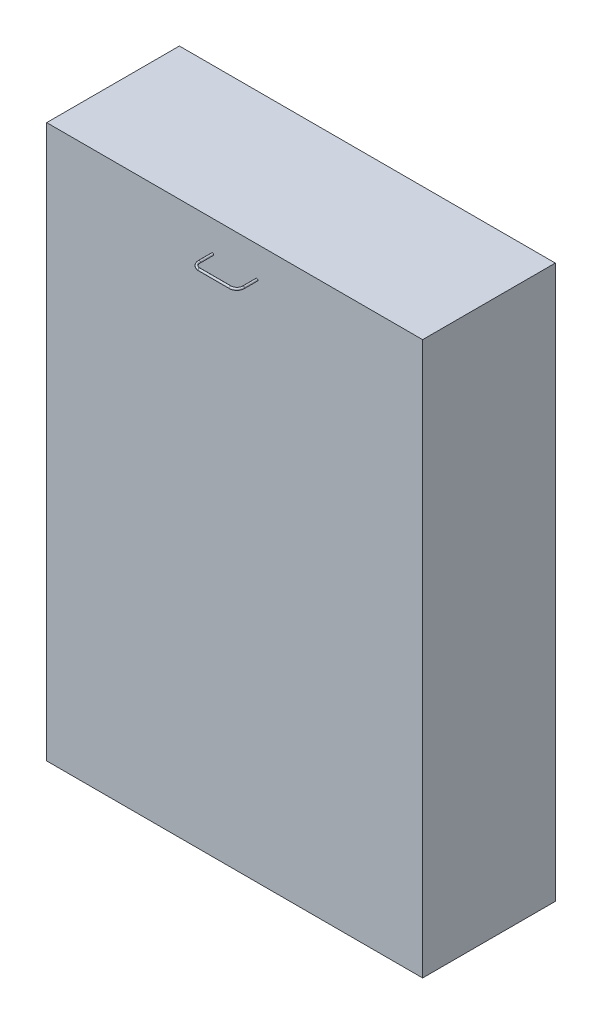
ISO-10303-21;
HEADER;
FILE_DESCRIPTION(('STEP AP214'),'2;1');
FILE_NAME('part.step','',(''),(''),'','','');
FILE_SCHEMA(('AUTOMOTIVE_DESIGN { 1 0 10303 214 1 1 1 1 }'));
ENDSEC;
DATA;
#1=APPLICATION_CONTEXT('core data for automotive mechanical design processes');
#2=APPLICATION_PROTOCOL_DEFINITION('international standard','automotive_design',2000,#1);
#3=PRODUCT_CONTEXT('',#1,'mechanical');
#4=PRODUCT('Part','Part','',(#3));
#5=PRODUCT_RELATED_PRODUCT_CATEGORY('part','',(#4));
#6=PRODUCT_DEFINITION_FORMATION('','',#4);
#7=PRODUCT_DEFINITION_CONTEXT('part definition',#1,'design');
#8=PRODUCT_DEFINITION('design','',#6,#7);
#9=PRODUCT_DEFINITION_SHAPE('','',#8);
#10=(LENGTH_UNIT() NAMED_UNIT(*) SI_UNIT(.MILLI.,.METRE.));
#11=(NAMED_UNIT(*) PLANE_ANGLE_UNIT() SI_UNIT($,.RADIAN.));
#12=(NAMED_UNIT(*) SI_UNIT($,.STERADIAN.) SOLID_ANGLE_UNIT());
#13=UNCERTAINTY_MEASURE_WITH_UNIT(LENGTH_MEASURE(1.E-05),#10,'distance_accuracy_value','');
#14=(GEOMETRIC_REPRESENTATION_CONTEXT(3) GLOBAL_UNCERTAINTY_ASSIGNED_CONTEXT((#13)) GLOBAL_UNIT_ASSIGNED_CONTEXT((#10,
#11,#12)) REPRESENTATION_CONTEXT('',''));
#15=CARTESIAN_POINT('',(0.,0.,0.));
#16=DIRECTION('',(0.,0.,1.));
#17=DIRECTION('',(1.,0.,0.));
#18=AXIS2_PLACEMENT_3D('',#15,#16,#17);
#19=CARTESIAN_POINT('',(0.,0.,300.));
#20=DIRECTION('',(0.,0.,1.));
#21=DIRECTION('',(1.,0.,0.));
#22=AXIS2_PLACEMENT_3D('',#19,#20,#21);
#23=PLANE('',#22);
#24=CARTESIAN_POINT('',(-50.,0.,300.));
#25=DIRECTION('',(0.,0.,1.));
#26=DIRECTION('',(1.,0.,0.));
#27=AXIS2_PLACEMENT_3D('',#24,#25,#26);
#28=CIRCLE('',#27,2.5);
#29=CARTESIAN_POINT('',(-47.5,0.,300.));
#30=VERTEX_POINT('',#29);
#31=EDGE_CURVE('E11',#30,#30,#28,.T.);
#32=ORIENTED_EDGE('',*,*,#31,.F.);
#33=EDGE_LOOP('',(#32));
#34=FACE_BOUND('',#33,.T.);
#35=DIRECTION('',(0.,1.,0.));
#36=VECTOR('',#35,1.);
#37=CARTESIAN_POINT('',(425.,70.,300.));
#38=LINE('',#37,#36);
#39=CARTESIAN_POINT('',(425.,-1180.,300.));
#40=VERTEX_POINT('',#39);
#41=CARTESIAN_POINT('',(425.,70.,300.));
#42=VERTEX_POINT('',#41);
#43=EDGE_CURVE('E87',#40,#42,#38,.T.);
#44=ORIENTED_EDGE('',*,*,#43,.T.);
#45=DIRECTION('',(-1.,0.,0.));
#46=VECTOR('',#45,1.);
#47=CARTESIAN_POINT('',(-425.,70.,300.));
#48=LINE('',#47,#46);
#49=CARTESIAN_POINT('',(-425.,70.,300.));
#50=VERTEX_POINT('',#49);
#51=EDGE_CURVE('E82',#42,#50,#48,.T.);
#52=ORIENTED_EDGE('',*,*,#51,.T.);
#53=DIRECTION('',(0.,-1.,0.));
#54=VECTOR('',#53,1.);
#55=CARTESIAN_POINT('',(-425.,70.,300.));
#56=LINE('',#55,#54);
#57=CARTESIAN_POINT('',(-425.,-1180.,300.));
#58=VERTEX_POINT('',#57);
#59=EDGE_CURVE('E85',#50,#58,#56,.T.);
#60=ORIENTED_EDGE('',*,*,#59,.T.);
#61=DIRECTION('',(1.,0.,0.));
#62=VECTOR('',#61,1.);
#63=CARTESIAN_POINT('',(-425.,-1180.,300.));
#64=LINE('',#63,#62);
#65=EDGE_CURVE('E51',#58,#40,#64,.T.);
#66=ORIENTED_EDGE('',*,*,#65,.T.);
#67=EDGE_LOOP('',(#44,#52,#60,#66));
#68=FACE_BOUND('',#67,.T.);
#69=CARTESIAN_POINT('',(50.,0.,300.));
#70=DIRECTION('',(0.,0.,-1.));
#71=DIRECTION('',(-1.,0.,0.));
#72=AXIS2_PLACEMENT_3D('',#69,#70,#71);
#73=CIRCLE('',#72,2.5);
#74=CARTESIAN_POINT('',(47.5,0.,300.));
#75=VERTEX_POINT('',#74);
#76=EDGE_CURVE('E103',#75,#75,#73,.T.);
#77=ORIENTED_EDGE('',*,*,#76,.T.);
#78=EDGE_LOOP('',(#77));
#79=FACE_BOUND('',#78,.T.);
#80=ADVANCED_FACE('F33',(#34,#68,#79),#23,.T.);
#81=CARTESIAN_POINT('',(425.,70.,300.));
#82=DIRECTION('',(-1.,0.,0.));
#83=DIRECTION('',(0.,-1.,0.));
#84=AXIS2_PLACEMENT_3D('',#81,#82,#83);
#85=PLANE('',#84);
#86=DIRECTION('',(0.,1.,0.));
#87=VECTOR('',#86,1.);
#88=CARTESIAN_POINT('',(425.,70.,0.));
#89=LINE('',#88,#87);
#90=CARTESIAN_POINT('',(425.,-1180.,0.));
#91=VERTEX_POINT('',#90);
#92=CARTESIAN_POINT('',(425.,70.,0.));
#93=VERTEX_POINT('',#92);
#94=EDGE_CURVE('E100',#91,#93,#89,.T.);
#95=ORIENTED_EDGE('',*,*,#94,.T.);
#96=DIRECTION('',(0.,0.,-1.));
#97=VECTOR('',#96,1.);
#98=CARTESIAN_POINT('',(425.,70.,300.));
#99=LINE('',#98,#97);
#100=EDGE_CURVE('E37',#42,#93,#99,.T.);
#101=ORIENTED_EDGE('',*,*,#100,.F.);
#102=ORIENTED_EDGE('',*,*,#43,.F.);
#103=DIRECTION('',(0.,0.,-1.));
#104=VECTOR('',#103,1.);
#105=CARTESIAN_POINT('',(425.,-1180.,300.));
#106=LINE('',#105,#104);
#107=EDGE_CURVE('E96',#40,#91,#106,.T.);
#108=ORIENTED_EDGE('',*,*,#107,.T.);
#109=EDGE_LOOP('',(#95,#101,#102,#108));
#110=FACE_BOUND('',#109,.T.);
#111=ADVANCED_FACE('F35',(#110),#85,.F.);
#112=CARTESIAN_POINT('',(-425.,70.,300.));
#113=DIRECTION('',(0.,-1.,0.));
#114=DIRECTION('',(0.,0.,-1.));
#115=AXIS2_PLACEMENT_3D('',#112,#113,#114);
#116=PLANE('',#115);
#117=DIRECTION('',(-1.,0.,0.));
#118=VECTOR('',#117,1.);
#119=CARTESIAN_POINT('',(-425.,70.,0.));
#120=LINE('',#119,#118);
#121=CARTESIAN_POINT('',(-425.,70.,0.));
#122=VERTEX_POINT('',#121);
#123=EDGE_CURVE('E92',#93,#122,#120,.T.);
#124=ORIENTED_EDGE('',*,*,#123,.T.);
#125=DIRECTION('',(0.,0.,-1.));
#126=VECTOR('',#125,1.);
#127=CARTESIAN_POINT('',(-425.,70.,300.));
#128=LINE('',#127,#126);
#129=EDGE_CURVE('E90',#50,#122,#128,.T.);
#130=ORIENTED_EDGE('',*,*,#129,.F.);
#131=ORIENTED_EDGE('',*,*,#51,.F.);
#132=ORIENTED_EDGE('',*,*,#100,.T.);
#133=EDGE_LOOP('',(#124,#130,#131,#132));
#134=FACE_BOUND('',#133,.T.);
#135=ADVANCED_FACE('F91',(#134),#116,.F.);
#136=CARTESIAN_POINT('',(-425.,70.,300.));
#137=DIRECTION('',(1.,0.,0.));
#138=DIRECTION('',(0.,1.,0.));
#139=AXIS2_PLACEMENT_3D('',#136,#137,#138);
#140=PLANE('',#139);
#141=DIRECTION('',(0.,-1.,0.));
#142=VECTOR('',#141,1.);
#143=CARTESIAN_POINT('',(-425.,70.,0.));
#144=LINE('',#143,#142);
#145=CARTESIAN_POINT('',(-425.,-1180.,0.));
#146=VERTEX_POINT('',#145);
#147=EDGE_CURVE('E68',#122,#146,#144,.T.);
#148=ORIENTED_EDGE('',*,*,#147,.T.);
#149=DIRECTION('',(0.,0.,-1.));
#150=VECTOR('',#149,1.);
#151=CARTESIAN_POINT('',(-425.,-1180.,300.));
#152=LINE('',#151,#150);
#153=EDGE_CURVE('E93',#58,#146,#152,.T.);
#154=ORIENTED_EDGE('',*,*,#153,.F.);
#155=ORIENTED_EDGE('',*,*,#59,.F.);
#156=ORIENTED_EDGE('',*,*,#129,.T.);
#157=EDGE_LOOP('',(#148,#154,#155,#156));
#158=FACE_BOUND('',#157,.T.);
#159=ADVANCED_FACE('F94',(#158),#140,.F.);
#160=CARTESIAN_POINT('',(-425.,-1180.,300.));
#161=DIRECTION('',(0.,1.,0.));
#162=DIRECTION('',(0.,0.,1.));
#163=AXIS2_PLACEMENT_3D('',#160,#161,#162);
#164=PLANE('',#163);
#165=DIRECTION('',(1.,0.,0.));
#166=VECTOR('',#165,1.);
#167=CARTESIAN_POINT('',(-425.,-1180.,0.));
#168=LINE('',#167,#166);
#169=EDGE_CURVE('E74',#146,#91,#168,.T.);
#170=ORIENTED_EDGE('',*,*,#169,.T.);
#171=ORIENTED_EDGE('',*,*,#107,.F.);
#172=ORIENTED_EDGE('',*,*,#65,.F.);
#173=ORIENTED_EDGE('',*,*,#153,.T.);
#174=EDGE_LOOP('',(#170,#171,#172,#173));
#175=FACE_BOUND('',#174,.T.);
#176=ADVANCED_FACE('F108',(#175),#164,.F.);
#177=CARTESIAN_POINT('',(0.,0.,0.));
#178=DIRECTION('',(0.,0.,1.));
#179=DIRECTION('',(1.,0.,0.));
#180=AXIS2_PLACEMENT_3D('',#177,#178,#179);
#181=PLANE('',#180);
#182=ORIENTED_EDGE('',*,*,#94,.F.);
#183=ORIENTED_EDGE('',*,*,#169,.F.);
#184=ORIENTED_EDGE('',*,*,#147,.F.);
#185=ORIENTED_EDGE('',*,*,#123,.F.);
#186=EDGE_LOOP('',(#182,#183,#184,#185));
#187=FACE_BOUND('',#186,.T.);
#188=ADVANCED_FACE('F111',(#187),#181,.F.);
#189=CARTESIAN_POINT('',(50.,0.,330.));
#190=DIRECTION('',(0.,0.,-1.));
#191=DIRECTION('',(-1.,0.,0.));
#192=AXIS2_PLACEMENT_3D('',#189,#190,#191);
#193=CYLINDRICAL_SURFACE('',#192,2.5);
#194=CARTESIAN_POINT('',(50.,0.,330.));
#195=DIRECTION('',(0.,0.,-1.));
#196=DIRECTION('',(-1.,0.,0.));
#197=AXIS2_PLACEMENT_3D('',#194,#195,#196);
#198=CIRCLE('',#197,2.5);
#199=CARTESIAN_POINT('',(52.5,0.,330.));
#200=VERTEX_POINT('',#199);
#201=EDGE_CURVE('E116',#200,#200,#198,.T.);
#202=ORIENTED_EDGE('',*,*,#201,.T.);
#203=EDGE_LOOP('',(#202));
#204=FACE_BOUND('',#203,.T.);
#205=ORIENTED_EDGE('',*,*,#76,.F.);
#206=EDGE_LOOP('',(#205));
#207=FACE_BOUND('',#206,.T.);
#208=ADVANCED_FACE('F145',(#204,#207),#193,.T.);
#209=CARTESIAN_POINT('',(35.,0.,330.));
#210=DIRECTION('',(0.,1.,0.));
#211=DIRECTION('',(0.,0.,1.));
#212=AXIS2_PLACEMENT_3D('',#209,#210,#211);
#213=TOROIDAL_SURFACE('',#212,15.,2.5);
#214=CARTESIAN_POINT('',(35.,0.,345.));
#215=DIRECTION('',(1.,0.,0.));
#216=DIRECTION('',(0.,0.,-1.));
#217=AXIS2_PLACEMENT_3D('',#214,#215,#216);
#218=CIRCLE('',#217,2.5);
#219=CARTESIAN_POINT('',(35.,0.,347.5));
#220=VERTEX_POINT('',#219);
#221=EDGE_CURVE('E119',#220,#220,#218,.T.);
#222=CARTESIAN_POINT('',(35.,0.,330.));
#223=DIRECTION('',(0.,1.,0.));
#224=DIRECTION('',(0.,0.,1.));
#225=AXIS2_PLACEMENT_3D('',#222,#223,#224);
#226=CIRCLE('',#225,17.5);
#227=EDGE_CURVE('',#220,#200,#226,.T.);
#228=ORIENTED_EDGE('',*,*,#221,.T.);
#229=ORIENTED_EDGE('',*,*,#201,.F.);
#230=ORIENTED_EDGE('',*,*,#227,.T.);
#231=ORIENTED_EDGE('',*,*,#227,.F.);
#232=EDGE_LOOP('',(#228,#230,#229,#231));
#233=FACE_BOUND('',#232,.T.);
#234=ADVANCED_FACE('F175',(#233),#213,.T.);
#235=CARTESIAN_POINT('',(-35.,0.,345.));
#236=DIRECTION('',(1.,0.,0.));
#237=DIRECTION('',(0.,0.,-1.));
#238=AXIS2_PLACEMENT_3D('',#235,#236,#237);
#239=CYLINDRICAL_SURFACE('',#238,2.5);
#240=CARTESIAN_POINT('',(-35.,0.,345.));
#241=DIRECTION('',(1.,0.,0.));
#242=DIRECTION('',(0.,0.,-1.));
#243=AXIS2_PLACEMENT_3D('',#240,#241,#242);
#244=CIRCLE('',#243,2.5);
#245=CARTESIAN_POINT('',(-35.,0.,347.5));
#246=VERTEX_POINT('',#245);
#247=EDGE_CURVE('E122',#246,#246,#244,.T.);
#248=ORIENTED_EDGE('',*,*,#247,.T.);
#249=EDGE_LOOP('',(#248));
#250=FACE_BOUND('',#249,.T.);
#251=ORIENTED_EDGE('',*,*,#221,.F.);
#252=EDGE_LOOP('',(#251));
#253=FACE_BOUND('',#252,.T.);
#254=ADVANCED_FACE('F182',(#250,#253),#239,.T.);
#255=CARTESIAN_POINT('',(-35.,0.,330.));
#256=DIRECTION('',(0.,1.,0.));
#257=DIRECTION('',(0.,0.,1.));
#258=AXIS2_PLACEMENT_3D('',#255,#256,#257);
#259=TOROIDAL_SURFACE('',#258,15.,2.5);
#260=CARTESIAN_POINT('',(-50.,0.,330.));
#261=DIRECTION('',(0.,0.,1.));
#262=DIRECTION('',(1.,0.,0.));
#263=AXIS2_PLACEMENT_3D('',#260,#261,#262);
#264=CIRCLE('',#263,2.5);
#265=CARTESIAN_POINT('',(-52.5,0.,330.));
#266=VERTEX_POINT('',#265);
#267=EDGE_CURVE('E124',#266,#266,#264,.T.);
#268=CARTESIAN_POINT('',(-35.,0.,330.));
#269=DIRECTION('',(0.,1.,0.));
#270=DIRECTION('',(0.,0.,1.));
#271=AXIS2_PLACEMENT_3D('',#268,#269,#270);
#272=CIRCLE('',#271,17.5);
#273=EDGE_CURVE('',#266,#246,#272,.T.);
#274=ORIENTED_EDGE('',*,*,#267,.T.);
#275=ORIENTED_EDGE('',*,*,#247,.F.);
#276=ORIENTED_EDGE('',*,*,#273,.T.);
#277=ORIENTED_EDGE('',*,*,#273,.F.);
#278=EDGE_LOOP('',(#274,#276,#275,#277));
#279=FACE_BOUND('',#278,.T.);
#280=ADVANCED_FACE('F129',(#279),#259,.T.);
#281=CARTESIAN_POINT('',(-50.,0.,330.));
#282=DIRECTION('',(0.,0.,-1.));
#283=DIRECTION('',(-1.,0.,0.));
#284=AXIS2_PLACEMENT_3D('',#281,#282,#283);
#285=CYLINDRICAL_SURFACE('',#284,2.5);
#286=ORIENTED_EDGE('',*,*,#267,.F.);
#287=EDGE_LOOP('',(#286));
#288=FACE_BOUND('',#287,.T.);
#289=ORIENTED_EDGE('',*,*,#31,.T.);
#290=EDGE_LOOP('',(#289));
#291=FACE_BOUND('',#290,.T.);
#292=ADVANCED_FACE('F132',(#288,#291),#285,.T.);
#293=CLOSED_SHELL('',(#80,#111,#135,#159,#176,#188,#208,#234,#254,#280,#292));
#294=MANIFOLD_SOLID_BREP('B2',#293);
#295=ADVANCED_BREP_SHAPE_REPRESENTATION('',(#18,#294),#14);
#296=SHAPE_DEFINITION_REPRESENTATION(#9,#295);
ENDSEC;
END-ISO-10303-21;
